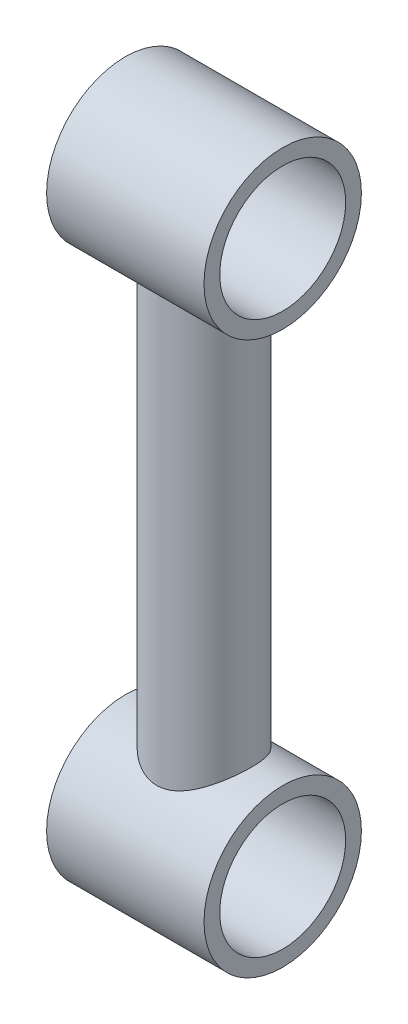
ISO-10303-21;
HEADER;
FILE_DESCRIPTION(('STEP AP214'),'2;1');
FILE_NAME('part.step','',(''),(''),'','','');
FILE_SCHEMA(('AUTOMOTIVE_DESIGN { 1 0 10303 214 1 1 1 1 }'));
ENDSEC;
DATA;
#1=APPLICATION_CONTEXT('core data for automotive mechanical design processes');
#2=APPLICATION_PROTOCOL_DEFINITION('international standard','automotive_design',2000,#1);
#3=PRODUCT_CONTEXT('',#1,'mechanical');
#4=PRODUCT('Part','Part','',(#3));
#5=PRODUCT_RELATED_PRODUCT_CATEGORY('part','',(#4));
#6=PRODUCT_DEFINITION_FORMATION('','',#4);
#7=PRODUCT_DEFINITION_CONTEXT('part definition',#1,'design');
#8=PRODUCT_DEFINITION('design','',#6,#7);
#9=PRODUCT_DEFINITION_SHAPE('','',#8);
#10=(LENGTH_UNIT() NAMED_UNIT(*) SI_UNIT(.MILLI.,.METRE.));
#11=(NAMED_UNIT(*) PLANE_ANGLE_UNIT() SI_UNIT($,.RADIAN.));
#12=(NAMED_UNIT(*) SI_UNIT($,.STERADIAN.) SOLID_ANGLE_UNIT());
#13=UNCERTAINTY_MEASURE_WITH_UNIT(LENGTH_MEASURE(1.E-05),#10,'distance_accuracy_value','');
#14=(GEOMETRIC_REPRESENTATION_CONTEXT(3) GLOBAL_UNCERTAINTY_ASSIGNED_CONTEXT((#13)) GLOBAL_UNIT_ASSIGNED_CONTEXT((#10,
#11,#12)) REPRESENTATION_CONTEXT('',''));
#15=CARTESIAN_POINT('',(0.,0.,0.));
#16=DIRECTION('',(0.,0.,1.));
#17=DIRECTION('',(1.,0.,0.));
#18=AXIS2_PLACEMENT_3D('',#15,#16,#17);
#19=CARTESIAN_POINT('',(50.,0.,0.));
#20=DIRECTION('',(1.,0.,0.));
#21=DIRECTION('',(0.,0.,-1.));
#22=AXIS2_PLACEMENT_3D('',#19,#20,#21);
#23=PLANE('',#22);
#24=CARTESIAN_POINT('',(50.,0.,0.));
#25=DIRECTION('',(1.,0.,0.));
#26=DIRECTION('',(0.,0.,-1.));
#27=AXIS2_PLACEMENT_3D('',#24,#25,#26);
#28=CIRCLE('',#27,50.);
#29=CARTESIAN_POINT('',(50.,0.,-50.));
#30=VERTEX_POINT('',#29);
#31=EDGE_CURVE('E10',#30,#30,#28,.T.);
#32=ORIENTED_EDGE('',*,*,#31,.T.);
#33=EDGE_LOOP('',(#32));
#34=FACE_BOUND('',#33,.T.);
#35=CARTESIAN_POINT('',(50.,0.,0.));
#36=DIRECTION('',(1.,0.,0.));
#37=DIRECTION('',(0.,0.,-1.));
#38=AXIS2_PLACEMENT_3D('',#35,#36,#37);
#39=CIRCLE('',#38,40.);
#40=CARTESIAN_POINT('',(50.,0.,-40.));
#41=VERTEX_POINT('',#40);
#42=EDGE_CURVE('E47',#41,#41,#39,.T.);
#43=ORIENTED_EDGE('',*,*,#42,.F.);
#44=EDGE_LOOP('',(#43));
#45=FACE_BOUND('',#44,.T.);
#46=ADVANCED_FACE('F36',(#34,#45),#23,.T.);
#47=CARTESIAN_POINT('',(-50.,0.,0.));
#48=DIRECTION('',(1.,0.,0.));
#49=DIRECTION('',(0.,0.,-1.));
#50=AXIS2_PLACEMENT_3D('',#47,#48,#49);
#51=PLANE('',#50);
#52=CARTESIAN_POINT('',(-50.,0.,0.));
#53=DIRECTION('',(1.,0.,0.));
#54=DIRECTION('',(0.,0.,-1.));
#55=AXIS2_PLACEMENT_3D('',#52,#53,#54);
#56=CIRCLE('',#55,50.);
#57=CARTESIAN_POINT('',(-50.,0.,-50.));
#58=VERTEX_POINT('',#57);
#59=EDGE_CURVE('E40',#58,#58,#56,.T.);
#60=ORIENTED_EDGE('',*,*,#59,.F.);
#61=EDGE_LOOP('',(#60));
#62=FACE_BOUND('',#61,.T.);
#63=CARTESIAN_POINT('',(-50.,0.,0.));
#64=DIRECTION('',(1.,0.,0.));
#65=DIRECTION('',(0.,0.,-1.));
#66=AXIS2_PLACEMENT_3D('',#63,#64,#65);
#67=CIRCLE('',#66,40.);
#68=CARTESIAN_POINT('',(-50.,0.,-40.));
#69=VERTEX_POINT('',#68);
#70=EDGE_CURVE('E49',#69,#69,#67,.T.);
#71=ORIENTED_EDGE('',*,*,#70,.T.);
#72=EDGE_LOOP('',(#71));
#73=FACE_BOUND('',#72,.T.);
#74=ADVANCED_FACE('F122',(#62,#73),#51,.F.);
#75=CARTESIAN_POINT('',(50.,0.,0.));
#76=DIRECTION('',(-1.,0.,0.));
#77=DIRECTION('',(0.,0.,1.));
#78=AXIS2_PLACEMENT_3D('',#75,#76,#77);
#79=CYLINDRICAL_SURFACE('',#78,50.);
#80=CARTESIAN_POINT('',(0.,40.,30.));
#81=CARTESIAN_POINT('',(0.754773079428564,39.9999924355509,30.0000054371733));
#82=CARTESIAN_POINT('',(1.50948924622845,40.0214403954393,29.9714752342614));
#83=CARTESIAN_POINT('',(3.0122226461602,40.1062444493847,29.8578998383123));
#84=CARTESIAN_POINT('',(3.76024032191946,40.1695977533699,29.7728584078095));
#85=CARTESIAN_POINT('',(5.2441364599569,40.3355499097489,29.5476372030003));
#86=CARTESIAN_POINT('',(5.98000318745316,40.438184622088,29.4074070436577));
#87=CARTESIAN_POINT('',(7.4337340008684,40.6785728662393,29.0739716563499));
#88=CARTESIAN_POINT('',(8.15159714350204,40.8163282339694,28.8807636589501));
#89=CARTESIAN_POINT('',(9.55986424580084,41.1208174466127,28.445531905068));
#90=CARTESIAN_POINT('',(10.2504322497716,41.2873290187728,28.2038804459787));
#91=CARTESIAN_POINT('',(11.6067524308452,41.644790948041,27.6733374325039));
#92=CARTESIAN_POINT('',(12.2725013269922,41.8357445215649,27.3844396594046));
#93=CARTESIAN_POINT('',(13.2505717076948,42.1364605134893,26.9175218389558));
#94=CARTESIAN_POINT('',(13.5732271148505,42.2391003045645,26.756254628249));
#95=CARTESIAN_POINT('',(14.2113934734989,42.4484734074239,26.4228282782668));
#96=CARTESIAN_POINT('',(14.5269062595888,42.5552056486378,26.2506719799854));
#97=CARTESIAN_POINT('',(15.4626009873731,42.8806472634173,25.7181480386));
#98=CARTESIAN_POINT('',(16.0719201724563,43.1045955804228,25.3417344973462));
#99=CARTESIAN_POINT('',(17.3324425072035,43.5893887462092,24.4995757857681));
#100=CARTESIAN_POINT('',(17.9796546133087,43.8513964328545,24.0285354757498));
#101=CARTESIAN_POINT('',(19.2332904604779,44.3801358051688,23.0373408991427));
#102=CARTESIAN_POINT('',(19.8397118501679,44.6468677620499,22.5171838053726));
#103=CARTESIAN_POINT('',(21.0099367523766,45.1790404761606,21.4294452953907));
#104=CARTESIAN_POINT('',(21.573709768574,45.4444801847927,20.8618305432127));
#105=CARTESIAN_POINT('',(22.6556839826831,45.9679876279243,19.681488615426));
#106=CARTESIAN_POINT('',(23.1738828552944,46.2260549858159,19.0687591408844));
#107=CARTESIAN_POINT('',(24.2153507973842,46.7564021460829,17.7316223686081));
#108=CARTESIAN_POINT('',(24.7330987799033,47.0271973104288,17.0023054886216));
#109=CARTESIAN_POINT('',(25.7047112154735,47.5453815754836,15.4942685286804));
#110=CARTESIAN_POINT('',(26.158569862743,47.7927685483637,14.715543968244));
#111=CARTESIAN_POINT('',(26.9971922251109,48.2568802958074,13.1136665383535));
#112=CARTESIAN_POINT('',(27.3820041074603,48.4736264229592,12.2905451657093));
#113=CARTESIAN_POINT('',(28.0777989799473,48.870041879193,10.6050928823802));
#114=CARTESIAN_POINT('',(28.3887941027499,49.0497173006521,9.7427684429875));
#115=CARTESIAN_POINT('',(28.9062031952631,49.3510766635053,8.06989441005335));
#116=CARTESIAN_POINT('',(29.1197644658465,49.4766580911894,7.26225533212929));
#117=CARTESIAN_POINT('',(29.4794276662173,49.6891894498777,5.62706899055214));
#118=CARTESIAN_POINT('',(29.6255335070595,49.7761416205889,4.79952288403312));
#119=CARTESIAN_POINT('',(29.8478515838854,49.9087796773502,3.13246717024253));
#120=CARTESIAN_POINT('',(29.924118545397,49.9544978737898,2.29296745458034));
#121=CARTESIAN_POINT('',(30.0056462782551,50.0033768126454,0.609322714269916));
#122=CARTESIAN_POINT('',(30.0109142739014,50.0065418849347,-0.234821829012518));
#123=CARTESIAN_POINT('',(29.95415500019,49.9725033434349,-1.81489529981786));
#124=CARTESIAN_POINT('',(29.9004022371462,49.9402633154867,-2.55124667795299));
#125=CARTESIAN_POINT('',(29.739124395353,49.8438693758083,-4.01585794086052));
#126=CARTESIAN_POINT('',(29.6316048566647,49.7797187521093,-4.74411865138388));
#127=CARTESIAN_POINT('',(29.3641437085351,49.620977165127,-6.18756243161353));
#128=CARTESIAN_POINT('',(29.20420022,49.5263851106974,-6.90274503157526));
#129=CARTESIAN_POINT('',(28.8337670024337,49.3088598139461,-8.31547959196037));
#130=CARTESIAN_POINT('',(28.6232751906837,49.1859254038559,-9.0130308246176));
#131=CARTESIAN_POINT('',(28.1526581576168,48.9135476146462,-10.3904072750655));
#132=CARTESIAN_POINT('',(27.8922569228414,48.7639571594241,-11.0701088227145));
#133=CARTESIAN_POINT('',(27.3251067169327,48.441789827711,-12.4041910107697));
#134=CARTESIAN_POINT('',(27.0183581811358,48.2692131671293,-13.0585718889383));
#135=CARTESIAN_POINT('',(26.3610135406394,47.9043659781244,-14.3392870539587));
#136=CARTESIAN_POINT('',(26.0104113625566,47.7120927225473,-14.9656174396906));
#137=CARTESIAN_POINT('',(25.2678641870583,47.3113861831583,-16.1878487666349));
#138=CARTESIAN_POINT('',(24.8759165978422,47.1029518864841,-16.7837477967321));
#139=CARTESIAN_POINT('',(24.0038251222862,46.6479274519125,-18.0124884902317));
#140=CARTESIAN_POINT('',(23.5187386533106,46.3997536842666,-18.6412397419404));
#141=CARTESIAN_POINT('',(22.502607304962,45.8930644751573,-19.8559772510624));
#142=CARTESIAN_POINT('',(21.9715592593429,45.6345483218784,-20.4419605571017));
#143=CARTESIAN_POINT('',(20.8653945949799,45.1123778800076,-21.5698875988211));
#144=CARTESIAN_POINT('',(20.2902225786288,44.8487174528413,-22.1117741531459));
#145=CARTESIAN_POINT('',(19.0986815642021,44.3223864406096,-23.1487409834838));
#146=CARTESIAN_POINT('',(18.4823106652618,44.0597159018081,-23.6438190972658));
#147=CARTESIAN_POINT('',(17.1365792062999,43.5114023855333,-24.6397506704863));
#148=CARTESIAN_POINT('',(16.4024071704545,43.2266309181986,-25.134607075518));
#149=CARTESIAN_POINT('',(14.8880542042171,42.6750161739419,-26.060187845091));
#150=CARTESIAN_POINT('',(14.107865737769,42.4081758489753,-26.4909016641373));
#151=CARTESIAN_POINT('',(12.5060980569954,41.9025771259453,-27.2835991057643));
#152=CARTESIAN_POINT('',(11.6845832451743,41.663776855557,-27.6456857193192));
#153=CARTESIAN_POINT('',(10.0036296959614,41.2239700066492,-28.2973336841537));
#154=CARTESIAN_POINT('',(9.14420601293799,41.0229485892923,-28.586923525734));
#155=CARTESIAN_POINT('',(7.61055439517442,40.7124607158074,-29.0266922229524));
#156=CARTESIAN_POINT('',(6.94318574540924,40.5926498926779,-29.1936352760004));
#157=CARTESIAN_POINT('',(5.59394741557894,40.3837646228614,-29.4819157838905));
#158=CARTESIAN_POINT('',(4.91208006934631,40.2946852685501,-29.6032605207762));
#159=CARTESIAN_POINT('',(3.53871644845565,40.1504262123343,-29.7986252970483));
#160=CARTESIAN_POINT('',(2.84723040991899,40.0952129290315,-29.8726922198134));
#161=CARTESIAN_POINT('',(1.4588162319373,40.0205909917451,-29.9725913229736));
#162=CARTESIAN_POINT('',(0.761887977392598,40.0011830970955,-29.9984224804208));
#163=CARTESIAN_POINT('',(-0.633092969562089,39.9989205730711,-30.001439292512));
#164=CARTESIAN_POINT('',(-1.33114588996816,40.016116263115,-29.9785579814936));
#165=CARTESIAN_POINT('',(-2.72212786656805,40.0864993514701,-29.8843768935634));
#166=CARTESIAN_POINT('',(-3.41505689605444,40.1396869372494,-29.8130768644567));
#167=CARTESIAN_POINT('',(-4.7913202770706,40.2801155116223,-29.6230684849219));
#168=CARTESIAN_POINT('',(-5.47464786325118,40.3673793756117,-29.5043282866804));
#169=CARTESIAN_POINT('',(-6.82695351863887,40.5729035284754,-29.2210546703214));
#170=CARTESIAN_POINT('',(-7.49593118416539,40.6911646881071,-29.0565199657639));
#171=CARTESIAN_POINT('',(-8.81493130388344,40.9546817127304,-28.6838971255832));
#172=CARTESIAN_POINT('',(-9.46498244311765,41.099893970628,-28.4758792783311));
#173=CARTESIAN_POINT('',(-10.7447421919885,41.4133350881076,-28.0180764187168));
#174=CARTESIAN_POINT('',(-11.3744425052817,41.5815731918176,-27.7682746224651));
#175=CARTESIAN_POINT('',(-12.6112149171688,41.9367586997092,-27.2288911048792));
#176=CARTESIAN_POINT('',(-13.2182827026054,42.1237096452986,-26.9393018498846));
#177=CARTESIAN_POINT('',(-14.4078239321894,42.5119906697039,-26.3223000055147));
#178=CARTESIAN_POINT('',(-14.9903036233565,42.713317060781,-25.9948971032765));
#179=CARTESIAN_POINT('',(-16.2323716245478,43.1636078905243,-25.2414085206861));
#180=CARTESIAN_POINT('',(-16.8868967379914,43.4146109863377,-24.8081780488878));
#181=CARTESIAN_POINT('',(-18.1580335537829,43.9246536038002,-23.8934940052003));
#182=CARTESIAN_POINT('',(-18.7746418168658,44.1836938512659,-23.4120360691994));
#183=CARTESIAN_POINT('',(-19.9684598947072,44.7040326920285,-22.4025038732756));
#184=CARTESIAN_POINT('',(-20.5456347277241,44.9653330646558,-21.8743891519663));
#185=CARTESIAN_POINT('',(-21.6578301169655,45.4842796758364,-20.7737943393439));
#186=CARTESIAN_POINT('',(-22.1928484895119,45.7419257245319,-20.2013119528565));
#187=CARTESIAN_POINT('',(-23.2851001855273,46.2811171660542,-18.9364779766343));
#188=CARTESIAN_POINT('',(-23.8361500707667,46.5614043507672,-18.2382257014387));
#189=CARTESIAN_POINT('',(-24.8772013130106,47.1028396436449,-16.7904682073809));
#190=CARTESIAN_POINT('',(-25.367196421245,47.3639857916585,-16.0409577545394));
#191=CARTESIAN_POINT('',(-26.281262214501,47.8597679650153,-14.4948690885771));
#192=CARTESIAN_POINT('',(-26.7053644094267,48.0944166466547,-13.6983136253921));
#193=CARTESIAN_POINT('',(-27.4829085808844,48.5304710877414,-12.0627242110709));
#194=CARTESIAN_POINT('',(-27.8363601907911,48.7318813786681,-11.2236960707639));
#195=CARTESIAN_POINT('',(-28.4447091895007,49.0820154369011,-9.57163089673215));
#196=CARTESIAN_POINT('',(-28.7048990218314,49.2335028420043,-8.7611299666941));
#197=CARTESIAN_POINT('',(-29.1565507968783,49.4981910314828,-7.11503534150894));
#198=CARTESIAN_POINT('',(-29.3480152961319,49.6113932400335,-6.27944258101489));
#199=CARTESIAN_POINT('',(-29.6590072808808,49.7959943798632,-4.59121918613497));
#200=CARTESIAN_POINT('',(-29.7786025195841,49.8674326814406,-3.73860538410503));
#201=CARTESIAN_POINT('',(-29.9440494730322,49.9664050743555,-2.02375863082272));
#202=CARTESIAN_POINT('',(-29.989910800952,49.9939448890237,-1.16152694827897));
#203=CARTESIAN_POINT('',(-30.0059636845279,50.0035796163062,0.448638369596453));
#204=CARTESIAN_POINT('',(-29.9854383726646,49.9912497430118,1.19646649879259));
#205=CARTESIAN_POINT('',(-29.8887419424398,49.9333091422452,2.68715701856055));
#206=CARTESIAN_POINT('',(-29.8125768518574,49.8877020198906,3.4300199382454));
#207=CARTESIAN_POINT('',(-29.6056163790939,49.7643009048837,4.90534527411018));
#208=CARTESIAN_POINT('',(-29.4748213780623,49.6865071367958,5.63780776281639));
#209=CARTESIAN_POINT('',(-29.160245460038,49.5005437474305,7.0873223698818));
#210=CARTESIAN_POINT('',(-28.9764629550249,49.3923732157727,7.80437402569055));
#211=CARTESIAN_POINT('',(-28.5614260115334,49.1500473875609,9.20713596965786));
#212=CARTESIAN_POINT('',(-28.3309850756384,49.0163393490528,9.89316522831645));
#213=CARTESIAN_POINT('',(-27.8232155122072,48.7246154429874,11.242249514208));
#214=CARTESIAN_POINT('',(-27.5458880423398,48.5666001756052,11.9053051081935));
#215=CARTESIAN_POINT('',(-26.946769704929,48.2293178600434,13.2054545723106));
#216=CARTESIAN_POINT('',(-26.6249739638318,48.0500484828003,13.8425455868989));
#217=CARTESIAN_POINT('',(-25.9393946780803,47.6735789595604,15.0881846024373));
#218=CARTESIAN_POINT('',(-25.5756084922492,47.4763776858225,15.6967308045441));
#219=CARTESIAN_POINT('',(-24.7667424868672,47.0453184951055,16.9476190424841));
#220=CARTESIAN_POINT('',(-24.317124761882,46.8098051726833,17.5864585689585));
#221=CARTESIAN_POINT('',(-23.3721450786188,46.325936934833,18.8241654588664));
#222=CARTESIAN_POINT('',(-22.876780423972,46.0775812628444,19.4230304625739));
#223=CARTESIAN_POINT('',(-21.8424161446594,45.5728772295248,20.5793876993337));
#224=CARTESIAN_POINT('',(-21.3033730570058,45.3165210670254,21.1368376378641));
#225=CARTESIAN_POINT('',(-20.1844237054672,44.8013865884645,22.2078589213948));
#226=CARTESIAN_POINT('',(-19.6045150692523,44.5426081325413,22.7214277151681));
#227=CARTESIAN_POINT('',(-18.329631573187,43.9954895932492,23.7652386100365));
#228=CARTESIAN_POINT('',(-17.6293953373685,43.7075675480209,24.2893195038196));
#229=CARTESIAN_POINT('',(-16.5443485377289,43.2851540783708,25.0295083694434));
#230=CARTESIAN_POINT('',(-16.1768518277079,43.1459165421275,25.2686007562635));
#231=CARTESIAN_POINT('',(-15.4304379178484,42.8716442524079,25.731195664513));
#232=CARTESIAN_POINT('',(-15.0515165547962,42.7366110683665,25.9546924020116));
#233=CARTESIAN_POINT('',(-13.8987545541486,42.3397557549875,26.6007590168042));
#234=CARTESIAN_POINT('',(-13.1084169941735,42.0859808338298,26.999246247833));
#235=CARTESIAN_POINT('',(-11.4877271374778,41.6097198076573,27.7276182166738));
#236=CARTESIAN_POINT('',(-10.6573852109228,41.3872256518336,28.0575206168377));
#237=CARTESIAN_POINT('',(-9.42187298081648,41.0929389990196,28.4850286249539));
#238=CARTESIAN_POINT('',(-9.03038758470864,41.0048657325039,28.6115719641199));
#239=CARTESIAN_POINT('',(-8.24078837678751,40.8382373313778,28.8489055913011));
#240=CARTESIAN_POINT('',(-7.84267626508382,40.7596797970073,28.9596998522838));
#241=CARTESIAN_POINT('',(-6.6392269319267,40.5395886546573,29.2678307379545));
#242=CARTESIAN_POINT('',(-5.82460119453228,40.4135940279387,29.440976404297));
#243=CARTESIAN_POINT('',(-4.17951386891393,40.209493955114,29.7191257226127));
#244=CARTESIAN_POINT('',(-3.34908470349393,40.1312994945307,29.8242560556143));
#245=CARTESIAN_POINT('',(-1.67907944636471,40.0265599738779,29.9646857763522));
#246=CARTESIAN_POINT('',(-0.839504519189611,40.0000084136404,29.9999939524452));
#247=CARTESIAN_POINT('',(0.,40.,30.));
#248=B_SPLINE_CURVE_WITH_KNOTS('',3,(#80,#81,#82,#83,#84,#85,#86,#87,#88,#89,#90,#91,#92,#93,
#94,#95,#96,#97,#98,#99,#100,#101,#102,#103,#104,#105,#106,#107,#108,#109,#110,#111,#112,#113,
#114,#115,#116,#117,#118,#119,#120,#121,#122,#123,#124,#125,#126,#127,#128,#129,#130,#131,#132,
#133,#134,#135,#136,#137,#138,#139,#140,#141,#142,#143,#144,#145,#146,#147,#148,#149,#150,#151,
#152,#153,#154,#155,#156,#157,#158,#159,#160,#161,#162,#163,#164,#165,#166,#167,#168,#169,#170,
#171,#172,#173,#174,#175,#176,#177,#178,#179,#180,#181,#182,#183,#184,#185,#186,#187,#188,#189,
#190,#191,#192,#193,#194,#195,#196,#197,#198,#199,#200,#201,#202,#203,#204,#205,#206,#207,#208,
#209,#210,#211,#212,#213,#214,#215,#216,#217,#218,#219,#220,#221,#222,#223,#224,#225,#226,#227,
#228,#229,#230,#231,#232,#233,#234,#235,#236,#237,#238,#239,#240,#241,#242,#243,#244,#245,#246,
#247),.UNSPECIFIED.,.T.,.F.,(4,2,2,2,2,2,2,2,2,2,2,2,2,2,2,2,2,2,2,2,2,2,2,2,2,2,2,2,2,2,2,2,2,
2,2,2,2,2,2,2,2,2,2,2,2,2,2,2,2,2,2,2,2,2,2,2,2,2,2,2,2,2,2,2,2,2,2,2,2,2,2,2,2,2,2,2,2,2,2,2,2,
2,2,4),(0.,2.26339065976523,4.52663063739906,6.79194167103308,9.05737114715353,11.3060153718576,
13.5549558090047,14.6798398054329,15.8044315174353,18.053680844433,20.578006829107,
23.1024782036474,25.6287380005962,28.1551266186055,30.954941350871,33.7550103451903,
36.553118342749,39.3507661189212,41.8814765390891,44.4120402106454,46.9406192393127,
49.4689409776018,51.683333411791,53.8974977247652,56.1117414113421,58.3260763460167,
60.5530302662239,62.7799632701391,65.0072050288865,67.2345864887666,69.7280443332067,
72.2216740863463,74.71848750613,77.2154162053875,80.002108172649,82.7892577871951,
85.5721909336379,88.3540287001651,90.4467811706651,92.5391992867497,94.6295392047497,
96.7199234526042,98.8131832342802,100.906453919041,103.001132238211,105.095869406138,
107.187246361405,109.279465412906,111.372081168462,113.46416201983,115.933925800171,
118.403913272112,120.876064180349,123.348343060374,126.142642921312,128.937228535818,
131.730473642596,134.523337623591,137.113418055671,139.703402128459,142.290940703078,
144.878141895905,147.120010063233,149.361635392023,151.603245081396,153.844921958156,
156.050442084091,158.25590776179,160.461615342147,162.667461736035,165.112763633141,
167.558209750834,170.006119860739,172.454172194157,175.21302745175,176.592687183035,
177.972855896356,180.731292892543,183.489018638118,184.750877047949,186.012416565873,
188.534926127152,191.052723792891,193.57020452896),.UNSPECIFIED.);
#249=CARTESIAN_POINT('',(0.,40.,30.));
#250=VERTEX_POINT('',#249);
#251=EDGE_CURVE('E52',#250,#250,#248,.T.);
#252=ORIENTED_EDGE('',*,*,#251,.F.);
#253=EDGE_LOOP('',(#252));
#254=FACE_BOUND('',#253,.T.);
#255=ORIENTED_EDGE('',*,*,#31,.F.);
#256=EDGE_LOOP('',(#255));
#257=FACE_BOUND('',#256,.T.);
#258=ORIENTED_EDGE('',*,*,#59,.T.);
#259=EDGE_LOOP('',(#258));
#260=FACE_BOUND('',#259,.T.);
#261=ADVANCED_FACE('F38',(#254,#257,#260),#79,.T.);
#262=CARTESIAN_POINT('',(50.,0.,0.));
#263=DIRECTION('',(-1.,0.,0.));
#264=DIRECTION('',(0.,0.,1.));
#265=AXIS2_PLACEMENT_3D('',#262,#263,#264);
#266=CYLINDRICAL_SURFACE('',#265,40.);
#267=ORIENTED_EDGE('',*,*,#42,.T.);
#268=EDGE_LOOP('',(#267));
#269=FACE_BOUND('',#268,.T.);
#270=ORIENTED_EDGE('',*,*,#70,.F.);
#271=EDGE_LOOP('',(#270));
#272=FACE_BOUND('',#271,.T.);
#273=ADVANCED_FACE('F115',(#269,#272),#266,.F.);
#274=CARTESIAN_POINT('',(0.,-50.001,0.));
#275=DIRECTION('',(0.,1.,0.));
#276=DIRECTION('',(0.,0.,1.));
#277=AXIS2_PLACEMENT_3D('',#274,#275,#276);
#278=CYLINDRICAL_SURFACE('',#277,30.);
#279=ORIENTED_EDGE('',*,*,#251,.T.);
#280=EDGE_LOOP('',(#279));
#281=FACE_BOUND('',#280,.T.);
#282=CARTESIAN_POINT('',(0.,311.,30.));
#283=CARTESIAN_POINT('',(0.754773079428564,311.000007564449,30.0000054371733));
#284=CARTESIAN_POINT('',(1.50948924622845,310.978559604561,29.9714752342614));
#285=CARTESIAN_POINT('',(3.0122226461602,310.893755550615,29.8578998383123));
#286=CARTESIAN_POINT('',(3.76024032191946,310.83040224663,29.7728584078095));
#287=CARTESIAN_POINT('',(5.2441364599569,310.664450090251,29.5476372030003));
#288=CARTESIAN_POINT('',(5.98000318745316,310.561815377912,29.4074070436577));
#289=CARTESIAN_POINT('',(7.43373400086841,310.321427133761,29.0739716563499));
#290=CARTESIAN_POINT('',(8.15159714350204,310.183671766031,28.8807636589501));
#291=CARTESIAN_POINT('',(9.55986424580084,309.879182553387,28.445531905068));
#292=CARTESIAN_POINT('',(10.2504322497716,309.712670981227,28.2038804459786));
#293=CARTESIAN_POINT('',(11.6067524308452,309.355209051959,27.6733374325039));
#294=CARTESIAN_POINT('',(12.2725013269922,309.164255478435,27.3844396594046));
#295=CARTESIAN_POINT('',(13.2505717076948,308.863539486511,26.9175218389558));
#296=CARTESIAN_POINT('',(13.5732271148505,308.760899695435,26.756254628249));
#297=CARTESIAN_POINT('',(14.2113934734989,308.551526592576,26.4228282782668));
#298=CARTESIAN_POINT('',(14.5269062595888,308.444794351362,26.2506719799854));
#299=CARTESIAN_POINT('',(15.4626009873731,308.119352736583,25.7181480386));
#300=CARTESIAN_POINT('',(16.0719201724563,307.895404419577,25.3417344973462));
#301=CARTESIAN_POINT('',(17.3324425072035,307.410611253791,24.4995757857681));
#302=CARTESIAN_POINT('',(17.9796546133087,307.148603567145,24.0285354757498));
#303=CARTESIAN_POINT('',(19.2332904604779,306.619864194831,23.0373408991428));
#304=CARTESIAN_POINT('',(19.8397118501679,306.35313223795,22.5171838053726));
#305=CARTESIAN_POINT('',(21.0099367523766,305.820959523839,21.4294452953907));
#306=CARTESIAN_POINT('',(21.5737097685739,305.555519815207,20.8618305432127));
#307=CARTESIAN_POINT('',(22.6556839826831,305.032012372076,19.681488615426));
#308=CARTESIAN_POINT('',(23.1738828552944,304.773945014184,19.0687591408844));
#309=CARTESIAN_POINT('',(24.2153507973842,304.243597853917,17.7316223686081));
#310=CARTESIAN_POINT('',(24.7330987799033,303.972802689571,17.0023054886216));
#311=CARTESIAN_POINT('',(25.7047112154735,303.454618424516,15.4942685286804));
#312=CARTESIAN_POINT('',(26.158569862743,303.207231451636,14.715543968244));
#313=CARTESIAN_POINT('',(26.9971922251109,302.743119704193,13.1136665383535));
#314=CARTESIAN_POINT('',(27.3820041074603,302.526373577041,12.2905451657093));
#315=CARTESIAN_POINT('',(28.0777989799473,302.129958120807,10.6050928823802));
#316=CARTESIAN_POINT('',(28.3887941027499,301.950282699348,9.7427684429875));
#317=CARTESIAN_POINT('',(28.9062031952631,301.648923336495,8.06989441005335));
#318=CARTESIAN_POINT('',(29.1197644658465,301.523341908811,7.26225533212928));
#319=CARTESIAN_POINT('',(29.4794276662173,301.310810550122,5.62706899055213));
#320=CARTESIAN_POINT('',(29.6255335070595,301.223858379411,4.79952288403311));
#321=CARTESIAN_POINT('',(29.8478515838854,301.09122032265,3.13246717024253));
#322=CARTESIAN_POINT('',(29.924118545397,301.04550212621,2.29296745458034));
#323=CARTESIAN_POINT('',(30.0056462782551,300.996623187355,0.609322714269915));
#324=CARTESIAN_POINT('',(30.0109142739014,300.993458115065,-0.234821829012517));
#325=CARTESIAN_POINT('',(29.95415500019,301.027496656565,-1.81489529981786));
#326=CARTESIAN_POINT('',(29.9004022371462,301.059736684513,-2.551246677953));
#327=CARTESIAN_POINT('',(29.739124395353,301.156130624192,-4.01585794086053));
#328=CARTESIAN_POINT('',(29.6316048566647,301.220281247891,-4.74411865138388));
#329=CARTESIAN_POINT('',(29.3641437085351,301.379022834873,-6.18756243161353));
#330=CARTESIAN_POINT('',(29.20420022,301.473614889302,-6.90274503157527));
#331=CARTESIAN_POINT('',(28.8337670024337,301.691140186054,-8.31547959196038));
#332=CARTESIAN_POINT('',(28.6232751906837,301.814074596144,-9.0130308246176));
#333=CARTESIAN_POINT('',(28.1526581576168,302.086452385354,-10.3904072750655));
#334=CARTESIAN_POINT('',(27.8922569228414,302.236042840576,-11.0701088227145));
#335=CARTESIAN_POINT('',(27.3251067169327,302.558210172289,-12.4041910107697));
#336=CARTESIAN_POINT('',(27.0183581811358,302.730786832871,-13.0585718889383));
#337=CARTESIAN_POINT('',(26.3610135406394,303.095634021876,-14.3392870539587));
#338=CARTESIAN_POINT('',(26.0104113625566,303.287907277453,-14.9656174396906));
#339=CARTESIAN_POINT('',(25.2678641870583,303.688613816842,-16.187848766635));
#340=CARTESIAN_POINT('',(24.8759165978422,303.897048113516,-16.7837477967321));
#341=CARTESIAN_POINT('',(24.0038251222862,304.352072548087,-18.0124884902317));
#342=CARTESIAN_POINT('',(23.5187386533106,304.600246315733,-18.6412397419404));
#343=CARTESIAN_POINT('',(22.502607304962,305.106935524843,-19.8559772510624));
#344=CARTESIAN_POINT('',(21.9715592593429,305.365451678122,-20.4419605571017));
#345=CARTESIAN_POINT('',(20.86539459498,305.887622119992,-21.569887598821));
#346=CARTESIAN_POINT('',(20.2902225786288,306.151282547159,-22.1117741531459));
#347=CARTESIAN_POINT('',(19.0986815642022,306.67761355939,-23.1487409834838));
#348=CARTESIAN_POINT('',(18.4823106652618,306.940284098192,-23.6438190972658));
#349=CARTESIAN_POINT('',(17.1365792062999,307.488597614467,-24.6397506704863));
#350=CARTESIAN_POINT('',(16.4024071704545,307.773369081801,-25.134607075518));
#351=CARTESIAN_POINT('',(14.8880542042171,308.324983826058,-26.060187845091));
#352=CARTESIAN_POINT('',(14.107865737769,308.591824151025,-26.4909016641373));
#353=CARTESIAN_POINT('',(12.5060980569954,309.097422874055,-27.2835991057643));
#354=CARTESIAN_POINT('',(11.6845832451744,309.336223144443,-27.6456857193192));
#355=CARTESIAN_POINT('',(10.0036296959614,309.776029993351,-28.2973336841537));
#356=CARTESIAN_POINT('',(9.14420601293799,309.977051410708,-28.586923525734));
#357=CARTESIAN_POINT('',(7.61055439517442,310.287539284193,-29.0266922229524));
#358=CARTESIAN_POINT('',(6.94318574540925,310.407350107322,-29.1936352760004));
#359=CARTESIAN_POINT('',(5.59394741557895,310.616235377139,-29.4819157838905));
#360=CARTESIAN_POINT('',(4.91208006934631,310.70531473145,-29.6032605207763));
#361=CARTESIAN_POINT('',(3.53871644845565,310.849573787666,-29.7986252970483));
#362=CARTESIAN_POINT('',(2.84723040991899,310.904787070969,-29.8726922198134));
#363=CARTESIAN_POINT('',(1.4588162319373,310.979409008255,-29.9725913229736));
#364=CARTESIAN_POINT('',(0.761887977392598,310.998816902904,-29.9984224804208));
#365=CARTESIAN_POINT('',(-0.633092969562088,311.001079426929,-30.001439292512));
#366=CARTESIAN_POINT('',(-1.33114588996816,310.983883736885,-29.9785579814936));
#367=CARTESIAN_POINT('',(-2.72212786656805,310.91350064853,-29.8843768935634));
#368=CARTESIAN_POINT('',(-3.41505689605444,310.860313062751,-29.8130768644567));
#369=CARTESIAN_POINT('',(-4.7913202770706,310.719884488378,-29.6230684849219));
#370=CARTESIAN_POINT('',(-5.47464786325118,310.632620624388,-29.5043282866804));
#371=CARTESIAN_POINT('',(-6.82695351863888,310.427096471525,-29.2210546703214));
#372=CARTESIAN_POINT('',(-7.4959311841654,310.308835311893,-29.0565199657639));
#373=CARTESIAN_POINT('',(-8.81493130388344,310.04531828727,-28.6838971255832));
#374=CARTESIAN_POINT('',(-9.46498244311766,309.900106029372,-28.4758792783311));
#375=CARTESIAN_POINT('',(-10.7447421919885,309.586664911892,-28.0180764187168));
#376=CARTESIAN_POINT('',(-11.3744425052817,309.418426808182,-27.7682746224651));
#377=CARTESIAN_POINT('',(-12.6112149171688,309.063241300291,-27.2288911048792));
#378=CARTESIAN_POINT('',(-13.2182827026054,308.876290354701,-26.9393018498846));
#379=CARTESIAN_POINT('',(-14.4078239321894,308.488009330296,-26.3223000055147));
#380=CARTESIAN_POINT('',(-14.9903036233565,308.286682939219,-25.9948971032765));
#381=CARTESIAN_POINT('',(-16.2323716245478,307.836392109476,-25.2414085206861));
#382=CARTESIAN_POINT('',(-16.8868967379914,307.585389013662,-24.8081780488878));
#383=CARTESIAN_POINT('',(-18.1580335537829,307.0753463962,-23.8934940052003));
#384=CARTESIAN_POINT('',(-18.7746418168658,306.816306148734,-23.4120360691994));
#385=CARTESIAN_POINT('',(-19.9684598947072,306.295967307972,-22.4025038732756));
#386=CARTESIAN_POINT('',(-20.5456347277241,306.034666935344,-21.8743891519663));
#387=CARTESIAN_POINT('',(-21.6578301169655,305.515720324164,-20.7737943393439));
#388=CARTESIAN_POINT('',(-22.1928484895119,305.258074275468,-20.2013119528565));
#389=CARTESIAN_POINT('',(-23.2851001855273,304.718882833946,-18.9364779766343));
#390=CARTESIAN_POINT('',(-23.8361500707667,304.438595649233,-18.2382257014387));
#391=CARTESIAN_POINT('',(-24.8772013130106,303.897160356355,-16.7904682073809));
#392=CARTESIAN_POINT('',(-25.367196421245,303.636014208341,-16.0409577545394));
#393=CARTESIAN_POINT('',(-26.281262214501,303.140232034985,-14.4948690885772));
#394=CARTESIAN_POINT('',(-26.7053644094267,302.905583353345,-13.6983136253921));
#395=CARTESIAN_POINT('',(-27.4829085808844,302.469528912259,-12.0627242110709));
#396=CARTESIAN_POINT('',(-27.8363601907911,302.268118621332,-11.2236960707639));
#397=CARTESIAN_POINT('',(-28.4447091895007,301.917984563099,-9.57163089673215));
#398=CARTESIAN_POINT('',(-28.7048990218314,301.766497157996,-8.76112996669411));
#399=CARTESIAN_POINT('',(-29.1565507968783,301.501808968517,-7.11503534150894));
#400=CARTESIAN_POINT('',(-29.3480152961319,301.388606759966,-6.27944258101488));
#401=CARTESIAN_POINT('',(-29.6590072808808,301.204005620137,-4.59121918613495));
#402=CARTESIAN_POINT('',(-29.7786025195841,301.132567318559,-3.73860538410502));
#403=CARTESIAN_POINT('',(-29.9440494730322,301.033594925644,-2.02375863082272));
#404=CARTESIAN_POINT('',(-29.989910800952,301.006055110976,-1.16152694827897));
#405=CARTESIAN_POINT('',(-30.0059636845279,300.996420383694,0.448638369596444));
#406=CARTESIAN_POINT('',(-29.9854383726646,301.008750256988,1.19646649879258));
#407=CARTESIAN_POINT('',(-29.8887419424398,301.066690857755,2.68715701856052));
#408=CARTESIAN_POINT('',(-29.8125768518574,301.112297980109,3.43001993824537));
#409=CARTESIAN_POINT('',(-29.6056163790939,301.235699095116,4.90534527411016));
#410=CARTESIAN_POINT('',(-29.4748213780623,301.313492863204,5.63780776281639));
#411=CARTESIAN_POINT('',(-29.160245460038,301.499456252569,7.0873223698818));
#412=CARTESIAN_POINT('',(-28.9764629550249,301.607626784227,7.80437402569055));
#413=CARTESIAN_POINT('',(-28.5614260115334,301.849952612439,9.20713596965785));
#414=CARTESIAN_POINT('',(-28.3309850756384,301.983660650947,9.89316522831644));
#415=CARTESIAN_POINT('',(-27.8232155122072,302.275384557013,11.242249514208));
#416=CARTESIAN_POINT('',(-27.5458880423398,302.433399824395,11.9053051081935));
#417=CARTESIAN_POINT('',(-26.946769704929,302.770682139957,13.2054545723106));
#418=CARTESIAN_POINT('',(-26.6249739638318,302.9499515172,13.8425455868989));
#419=CARTESIAN_POINT('',(-25.9393946780803,303.32642104044,15.0881846024373));
#420=CARTESIAN_POINT('',(-25.5756084922492,303.523622314177,15.6967308045441));
#421=CARTESIAN_POINT('',(-24.7667424868672,303.954681504894,16.9476190424841));
#422=CARTESIAN_POINT('',(-24.317124761882,304.190194827317,17.5864585689585));
#423=CARTESIAN_POINT('',(-23.3721450786188,304.674063065167,18.8241654588664));
#424=CARTESIAN_POINT('',(-22.876780423972,304.922418737156,19.4230304625739));
#425=CARTESIAN_POINT('',(-21.8424161446594,305.427122770475,20.5793876993337));
#426=CARTESIAN_POINT('',(-21.3033730570058,305.683478932975,21.1368376378641));
#427=CARTESIAN_POINT('',(-20.1844237054672,306.198613411535,22.2078589213948));
#428=CARTESIAN_POINT('',(-19.6045150692523,306.457391867459,22.7214277151681));
#429=CARTESIAN_POINT('',(-18.329631573187,307.004510406751,23.7652386100365));
#430=CARTESIAN_POINT('',(-17.6293953373685,307.292432451979,24.2893195038196));
#431=CARTESIAN_POINT('',(-16.5443485377289,307.714845921629,25.0295083694434));
#432=CARTESIAN_POINT('',(-16.1768518277079,307.854083457872,25.2686007562635));
#433=CARTESIAN_POINT('',(-15.4304379178483,308.128355747592,25.731195664513));
#434=CARTESIAN_POINT('',(-15.0515165547961,308.263388931634,25.9546924020116));
#435=CARTESIAN_POINT('',(-13.8987545541486,308.660244245012,26.6007590168042));
#436=CARTESIAN_POINT('',(-13.1084169941735,308.91401916617,26.999246247833));
#437=CARTESIAN_POINT('',(-11.4877271374779,309.390280192343,27.7276182166738));
#438=CARTESIAN_POINT('',(-10.6573852109228,309.612774348166,28.0575206168377));
#439=CARTESIAN_POINT('',(-9.42187298081648,309.90706100098,28.4850286249539));
#440=CARTESIAN_POINT('',(-9.03038758470864,309.995134267496,28.6115719641199));
#441=CARTESIAN_POINT('',(-8.24078837678752,310.161762668622,28.8489055913011));
#442=CARTESIAN_POINT('',(-7.84267626508383,310.240320202993,28.9596998522838));
#443=CARTESIAN_POINT('',(-6.63922693192672,310.460411345343,29.2678307379545));
#444=CARTESIAN_POINT('',(-5.82460119453229,310.586405972061,29.440976404297));
#445=CARTESIAN_POINT('',(-4.17951386891392,310.790506044886,29.7191257226127));
#446=CARTESIAN_POINT('',(-3.34908470349392,310.868700505469,29.8242560556144));
#447=CARTESIAN_POINT('',(-1.6790794463647,310.973440026122,29.9646857763522));
#448=CARTESIAN_POINT('',(-0.839504519189606,310.99999158636,29.9999939524452));
#449=CARTESIAN_POINT('',(0.,311.,30.));
#450=B_SPLINE_CURVE_WITH_KNOTS('',3,(#282,#283,#284,#285,#286,#287,#288,#289,#290,#291,#292,
#293,#294,#295,#296,#297,#298,#299,#300,#301,#302,#303,#304,#305,#306,#307,#308,#309,#310,#311,
#312,#313,#314,#315,#316,#317,#318,#319,#320,#321,#322,#323,#324,#325,#326,#327,#328,#329,#330,
#331,#332,#333,#334,#335,#336,#337,#338,#339,#340,#341,#342,#343,#344,#345,#346,#347,#348,#349,
#350,#351,#352,#353,#354,#355,#356,#357,#358,#359,#360,#361,#362,#363,#364,#365,#366,#367,#368,
#369,#370,#371,#372,#373,#374,#375,#376,#377,#378,#379,#380,#381,#382,#383,#384,#385,#386,#387,
#388,#389,#390,#391,#392,#393,#394,#395,#396,#397,#398,#399,#400,#401,#402,#403,#404,#405,#406,
#407,#408,#409,#410,#411,#412,#413,#414,#415,#416,#417,#418,#419,#420,#421,#422,#423,#424,#425,
#426,#427,#428,#429,#430,#431,#432,#433,#434,#435,#436,#437,#438,#439,#440,#441,#442,#443,#444,
#445,#446,#447,#448,#449),.UNSPECIFIED.,.T.,.F.,(4,2,2,2,2,2,2,2,2,2,2,2,2,2,2,2,2,2,2,2,2,2,2,
2,2,2,2,2,2,2,2,2,2,2,2,2,2,2,2,2,2,2,2,2,2,2,2,2,2,2,2,2,2,2,2,2,2,2,2,2,2,2,2,2,2,2,2,2,2,2,2,
2,2,2,2,2,2,2,2,2,2,2,2,4),(0.,2.26339065976522,4.52663063739906,6.79194167103309,
9.05737114715353,11.3060153718576,13.5549558090047,14.6798398054329,15.8044315174352,
18.053680844433,20.5780068291069,23.1024782036474,25.6287380005962,28.1551266186055,
30.954941350871,33.7550103451903,36.553118342749,39.3507661189212,41.8814765390891,
44.4120402106454,46.9406192393127,49.4689409776018,51.683333411791,53.8974977247652,
56.1117414113421,58.3260763460167,60.5530302662239,62.7799632701391,65.0072050288865,
67.2345864887666,69.7280443332067,72.2216740863463,74.71848750613,77.2154162053875,
80.002108172649,82.7892577871951,85.5721909336379,88.3540287001651,90.4467811706651,
92.5391992867497,94.6295392047498,96.7199234526042,98.8131832342803,100.906453919041,
103.001132238211,105.095869406138,107.187246361405,109.279465412906,111.372081168463,
113.46416201983,115.933925800171,118.403913272112,120.876064180349,123.348343060374,
126.142642921312,128.937228535818,131.730473642596,134.523337623591,137.113418055671,
139.703402128459,142.290940703078,144.878141895905,147.120010063233,149.361635392023,
151.603245081396,153.844921958157,156.050442084091,158.25590776179,160.461615342147,
162.667461736036,165.112763633142,167.558209750834,170.006119860739,172.454172194157,
175.213027451751,176.592687183035,177.972855896356,180.731292892543,183.489018638118,
184.750877047949,186.012416565873,188.534926127152,191.052723792892,193.57020452896),.UNSPECIFIED.);
#451=CARTESIAN_POINT('',(0.,311.,30.));
#452=VERTEX_POINT('',#451);
#453=EDGE_CURVE('E90',#452,#452,#450,.T.);
#454=ORIENTED_EDGE('',*,*,#453,.F.);
#455=EDGE_LOOP('',(#454));
#456=FACE_BOUND('',#455,.T.);
#457=ADVANCED_FACE('F65',(#281,#456),#278,.T.);
#458=CARTESIAN_POINT('',(50.,351.,0.));
#459=DIRECTION('',(1.,0.,0.));
#460=DIRECTION('',(0.,0.,-1.));
#461=AXIS2_PLACEMENT_3D('',#458,#459,#460);
#462=PLANE('',#461);
#463=CARTESIAN_POINT('',(50.,351.,0.));
#464=DIRECTION('',(-1.,0.,0.));
#465=DIRECTION('',(0.,0.,-1.));
#466=AXIS2_PLACEMENT_3D('',#463,#464,#465);
#467=CIRCLE('',#466,50.);
#468=CARTESIAN_POINT('',(50.,351.,-50.));
#469=VERTEX_POINT('',#468);
#470=EDGE_CURVE('E62',#469,#469,#467,.T.);
#471=ORIENTED_EDGE('',*,*,#470,.F.);
#472=EDGE_LOOP('',(#471));
#473=FACE_BOUND('',#472,.T.);
#474=CARTESIAN_POINT('',(50.,351.,0.));
#475=DIRECTION('',(-1.,0.,0.));
#476=DIRECTION('',(0.,0.,-1.));
#477=AXIS2_PLACEMENT_3D('',#474,#475,#476);
#478=CIRCLE('',#477,40.);
#479=CARTESIAN_POINT('',(50.,351.,-40.));
#480=VERTEX_POINT('',#479);
#481=EDGE_CURVE('E97',#480,#480,#478,.T.);
#482=ORIENTED_EDGE('',*,*,#481,.T.);
#483=EDGE_LOOP('',(#482));
#484=FACE_BOUND('',#483,.T.);
#485=ADVANCED_FACE('F78',(#473,#484),#462,.T.);
#486=CARTESIAN_POINT('',(-50.,351.,0.));
#487=DIRECTION('',(1.,0.,0.));
#488=DIRECTION('',(0.,0.,-1.));
#489=AXIS2_PLACEMENT_3D('',#486,#487,#488);
#490=PLANE('',#489);
#491=CARTESIAN_POINT('',(-50.,351.,0.));
#492=DIRECTION('',(-1.,0.,0.));
#493=DIRECTION('',(0.,0.,-1.));
#494=AXIS2_PLACEMENT_3D('',#491,#492,#493);
#495=CIRCLE('',#494,50.);
#496=CARTESIAN_POINT('',(-50.,351.,-50.));
#497=VERTEX_POINT('',#496);
#498=EDGE_CURVE('E63',#497,#497,#495,.T.);
#499=ORIENTED_EDGE('',*,*,#498,.T.);
#500=EDGE_LOOP('',(#499));
#501=FACE_BOUND('',#500,.T.);
#502=CARTESIAN_POINT('',(-50.,351.,0.));
#503=DIRECTION('',(-1.,0.,0.));
#504=DIRECTION('',(0.,0.,-1.));
#505=AXIS2_PLACEMENT_3D('',#502,#503,#504);
#506=CIRCLE('',#505,40.);
#507=CARTESIAN_POINT('',(-50.,351.,-40.));
#508=VERTEX_POINT('',#507);
#509=EDGE_CURVE('E96',#508,#508,#506,.T.);
#510=ORIENTED_EDGE('',*,*,#509,.F.);
#511=EDGE_LOOP('',(#510));
#512=FACE_BOUND('',#511,.T.);
#513=ADVANCED_FACE('F74',(#501,#512),#490,.F.);
#514=CARTESIAN_POINT('',(50.,351.,0.));
#515=DIRECTION('',(-1.,0.,0.));
#516=DIRECTION('',(0.,0.,1.));
#517=AXIS2_PLACEMENT_3D('',#514,#515,#516);
#518=CYLINDRICAL_SURFACE('',#517,50.);
#519=ORIENTED_EDGE('',*,*,#453,.T.);
#520=EDGE_LOOP('',(#519));
#521=FACE_BOUND('',#520,.T.);
#522=ORIENTED_EDGE('',*,*,#470,.T.);
#523=EDGE_LOOP('',(#522));
#524=FACE_BOUND('',#523,.T.);
#525=ORIENTED_EDGE('',*,*,#498,.F.);
#526=EDGE_LOOP('',(#525));
#527=FACE_BOUND('',#526,.T.);
#528=ADVANCED_FACE('F70',(#521,#524,#527),#518,.T.);
#529=CARTESIAN_POINT('',(50.,351.,0.));
#530=DIRECTION('',(-1.,0.,0.));
#531=DIRECTION('',(0.,0.,1.));
#532=AXIS2_PLACEMENT_3D('',#529,#530,#531);
#533=CYLINDRICAL_SURFACE('',#532,40.);
#534=ORIENTED_EDGE('',*,*,#481,.F.);
#535=EDGE_LOOP('',(#534));
#536=FACE_BOUND('',#535,.T.);
#537=ORIENTED_EDGE('',*,*,#509,.T.);
#538=EDGE_LOOP('',(#537));
#539=FACE_BOUND('',#538,.T.);
#540=ADVANCED_FACE('F73',(#536,#539),#533,.F.);
#541=CLOSED_SHELL('',(#46,#74,#261,#273,#457,#485,#513,#528,#540));
#542=MANIFOLD_SOLID_BREP('B2',#541);
#543=ADVANCED_BREP_SHAPE_REPRESENTATION('',(#18,#542),#14);
#544=SHAPE_DEFINITION_REPRESENTATION(#9,#543);
ENDSEC;
END-ISO-10303-21;
